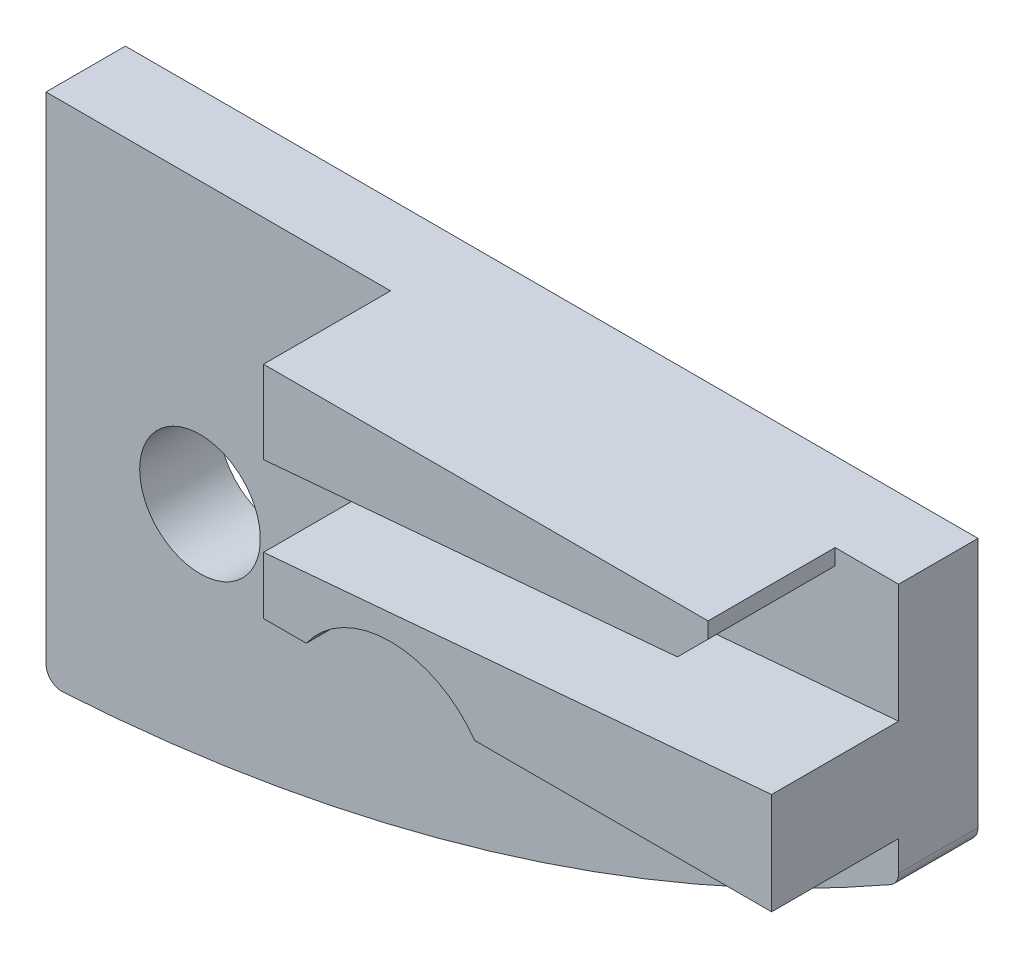
ISO-10303-21;
HEADER;
FILE_DESCRIPTION(('STEP AP214'),'2;1');
FILE_NAME('part.step','',(''),(''),'','','');
FILE_SCHEMA(('AUTOMOTIVE_DESIGN { 1 0 10303 214 1 1 1 1 }'));
ENDSEC;
DATA;
#1=APPLICATION_CONTEXT('core data for automotive mechanical design processes');
#2=APPLICATION_PROTOCOL_DEFINITION('international standard','automotive_design',2000,#1);
#3=PRODUCT_CONTEXT('',#1,'mechanical');
#4=PRODUCT('Part','Part','',(#3));
#5=PRODUCT_RELATED_PRODUCT_CATEGORY('part','',(#4));
#6=PRODUCT_DEFINITION_FORMATION('','',#4);
#7=PRODUCT_DEFINITION_CONTEXT('part definition',#1,'design');
#8=PRODUCT_DEFINITION('design','',#6,#7);
#9=PRODUCT_DEFINITION_SHAPE('','',#8);
#10=(LENGTH_UNIT() NAMED_UNIT(*) SI_UNIT(.MILLI.,.METRE.));
#11=(NAMED_UNIT(*) PLANE_ANGLE_UNIT() SI_UNIT($,.RADIAN.));
#12=(NAMED_UNIT(*) SI_UNIT($,.STERADIAN.) SOLID_ANGLE_UNIT());
#13=UNCERTAINTY_MEASURE_WITH_UNIT(LENGTH_MEASURE(1.E-05),#10,'distance_accuracy_value','');
#14=(GEOMETRIC_REPRESENTATION_CONTEXT(3) GLOBAL_UNCERTAINTY_ASSIGNED_CONTEXT((#13)) GLOBAL_UNIT_ASSIGNED_CONTEXT((#10,
#11,#12)) REPRESENTATION_CONTEXT('',''));
#15=CARTESIAN_POINT('',(0.,0.,0.));
#16=DIRECTION('',(0.,0.,1.));
#17=DIRECTION('',(1.,0.,0.));
#18=AXIS2_PLACEMENT_3D('',#15,#16,#17);
#19=CARTESIAN_POINT('',(50.8,11.7820282764121,8.255));
#20=DIRECTION('',(0.,1.,0.));
#21=DIRECTION('',(0.,0.,1.));
#22=AXIS2_PLACEMENT_3D('',#19,#20,#21);
#23=PLANE('',#22);
#24=DIRECTION('',(-1.,0.,0.));
#25=VECTOR('',#24,1.);
#26=CARTESIAN_POINT('',(50.8,11.7820282764121,3.175));
#27=LINE('',#26,#25);
#28=CARTESIAN_POINT('',(50.8,11.7820282764121,3.175));
#29=VERTEX_POINT('',#28);
#30=CARTESIAN_POINT('',(38.9293716665378,11.7820282764121,3.175));
#31=VERTEX_POINT('',#30);
#32=EDGE_CURVE('E169',#29,#31,#27,.T.);
#33=ORIENTED_EDGE('',*,*,#32,.F.);
#34=DIRECTION('',(0.,0.,-1.));
#35=VECTOR('',#34,1.);
#36=CARTESIAN_POINT('',(50.8,11.7820282764121,8.255));
#37=LINE('',#36,#35);
#38=CARTESIAN_POINT('',(50.8,11.7820282764121,8.255));
#39=VERTEX_POINT('',#38);
#40=EDGE_CURVE('E196',#39,#29,#37,.T.);
#41=ORIENTED_EDGE('',*,*,#40,.F.);
#42=DIRECTION('',(-1.,0.,0.));
#43=VECTOR('',#42,1.);
#44=CARTESIAN_POINT('',(50.8,11.7820282764121,8.255));
#45=LINE('',#44,#43);
#46=CARTESIAN_POINT('',(38.9293716665378,11.7820282764121,8.255));
#47=VERTEX_POINT('',#46);
#48=EDGE_CURVE('E317',#39,#47,#45,.T.);
#49=ORIENTED_EDGE('',*,*,#48,.T.);
#50=DIRECTION('',(0.,0.,1.));
#51=VECTOR('',#50,1.);
#52=CARTESIAN_POINT('',(38.9293716665378,11.7820282764121,3.175));
#53=LINE('',#52,#51);
#54=EDGE_CURVE('E159',#31,#47,#53,.T.);
#55=ORIENTED_EDGE('',*,*,#54,.F.);
#56=EDGE_LOOP('',(#33,#41,#49,#55));
#57=FACE_BOUND('',#56,.T.);
#58=ADVANCED_FACE('F35',(#57),#23,.F.);
#59=CARTESIAN_POINT('',(12.7,76.2,3.175));
#60=DIRECTION('',(0.,0.,-1.));
#61=DIRECTION('',(1.,0.,0.));
#62=AXIS2_PLACEMENT_3D('',#59,#60,#61);
#63=PLANE('',#62);
#64=CARTESIAN_POINT('',(22.86,9.398,3.175));
#65=DIRECTION('',(0.,0.,-1.));
#66=DIRECTION('',(-1.,0.,0.));
#67=AXIS2_PLACEMENT_3D('',#64,#65,#66);
#68=CIRCLE('',#67,2.413);
#69=CARTESIAN_POINT('',(20.447,9.398,3.175));
#70=VERTEX_POINT('',#69);
#71=EDGE_CURVE('E219',#70,#70,#68,.T.);
#72=ORIENTED_EDGE('',*,*,#71,.T.);
#73=EDGE_LOOP('',(#72));
#74=FACE_BOUND('',#73,.T.);
#75=CARTESIAN_POINT('',(32.1906283334622,11.7820282764121,3.175));
#76=VERTEX_POINT('',#75);
#77=CARTESIAN_POINT('',(30.48,11.7820282764121,3.175));
#78=VERTEX_POINT('',#77);
#79=EDGE_CURVE('E167',#76,#78,#27,.T.);
#80=ORIENTED_EDGE('',*,*,#79,.T.);
#81=DIRECTION('',(0.,1.,0.));
#82=VECTOR('',#81,1.);
#83=CARTESIAN_POINT('',(30.48,11.7820282764121,3.175));
#84=LINE('',#83,#82);
#85=CARTESIAN_POINT('',(30.48,14.0758832234899,3.175));
#86=VERTEX_POINT('',#85);
#87=EDGE_CURVE('E187',#78,#86,#84,.T.);
#88=ORIENTED_EDGE('',*,*,#87,.T.);
#89=DIRECTION('',(0.996227084748133,0.0867847660262814,0.));
#90=VECTOR('',#89,1.);
#91=CARTESIAN_POINT('',(50.8,15.8460282764121,3.175));
#92=LINE('',#91,#90);
#93=CARTESIAN_POINT('',(50.8,15.8460282764121,3.175));
#94=VERTEX_POINT('',#93);
#95=EDGE_CURVE('E202',#86,#94,#92,.T.);
#96=ORIENTED_EDGE('',*,*,#95,.T.);
#97=DIRECTION('',(0.,-1.,0.));
#98=VECTOR('',#97,1.);
#99=CARTESIAN_POINT('',(50.8,20.591373254799,3.175));
#100=LINE('',#99,#98);
#101=CARTESIAN_POINT('',(50.8,20.591373254799,3.175));
#102=VERTEX_POINT('',#101);
#103=EDGE_CURVE('E180',#102,#94,#100,.T.);
#104=ORIENTED_EDGE('',*,*,#103,.F.);
#105=DIRECTION('',(1.,0.,0.));
#106=VECTOR('',#105,1.);
#107=CARTESIAN_POINT('',(12.7,20.591373254799,3.175));
#108=LINE('',#107,#106);
#109=CARTESIAN_POINT('',(48.26,20.591373254799,3.175));
#110=VERTEX_POINT('',#109);
#111=EDGE_CURVE('E228',#110,#102,#108,.T.);
#112=ORIENTED_EDGE('',*,*,#111,.F.);
#113=DIRECTION('',(0.,-1.,0.));
#114=VECTOR('',#113,1.);
#115=CARTESIAN_POINT('',(48.26,19.956373254799,3.175));
#116=LINE('',#115,#114);
#117=CARTESIAN_POINT('',(48.26,19.956373254799,3.175));
#118=VERTEX_POINT('',#117);
#119=EDGE_CURVE('E299',#110,#118,#116,.T.);
#120=ORIENTED_EDGE('',*,*,#119,.T.);
#121=DIRECTION('',(-0.70710678118655,-0.707106781186546,0.));
#122=VECTOR('',#121,1.);
#123=CARTESIAN_POINT('',(47.0322104334303,18.7285836882293,3.175));
#124=LINE('',#123,#122);
#125=CARTESIAN_POINT('',(47.0322104334303,18.7285836882293,3.175));
#126=VERTEX_POINT('',#125);
#127=EDGE_CURVE('E302',#118,#126,#124,.T.);
#128=ORIENTED_EDGE('',*,*,#127,.T.);
#129=DIRECTION('',(-0.996227084748133,-0.0867847660262814,0.));
#130=VECTOR('',#129,1.);
#131=CARTESIAN_POINT('',(30.48,17.2866637367694,3.175));
#132=LINE('',#131,#130);
#133=CARTESIAN_POINT('',(30.48,17.2866637367694,3.175));
#134=VERTEX_POINT('',#133);
#135=EDGE_CURVE('E286',#126,#134,#132,.T.);
#136=ORIENTED_EDGE('',*,*,#135,.T.);
#137=DIRECTION('',(0.,1.,0.));
#138=VECTOR('',#137,1.);
#139=CARTESIAN_POINT('',(30.48,20.591373254799,3.175));
#140=LINE('',#139,#138);
#141=CARTESIAN_POINT('',(30.48,20.591373254799,3.175));
#142=VERTEX_POINT('',#141);
#143=EDGE_CURVE('E279',#134,#142,#140,.T.);
#144=ORIENTED_EDGE('',*,*,#143,.T.);
#145=CARTESIAN_POINT('',(16.7,20.591373254799,3.175));
#146=VERTEX_POINT('',#145);
#147=EDGE_CURVE('E230',#146,#142,#108,.T.);
#148=ORIENTED_EDGE('',*,*,#147,.F.);
#149=DIRECTION('',(0.,-1.,0.));
#150=VECTOR('',#149,1.);
#151=CARTESIAN_POINT('',(16.7,24.7848492803447,3.175));
#152=LINE('',#151,#150);
#153=CARTESIAN_POINT('',(16.7,0.77728458879249,3.175));
#154=VERTEX_POINT('',#153);
#155=EDGE_CURVE('E275',#146,#154,#152,.T.);
#156=ORIENTED_EDGE('',*,*,#155,.T.);
#157=CARTESIAN_POINT('',(17.335,0.77728458879249,3.175));
#158=DIRECTION('',(0.,0.,1.));
#159=DIRECTION('',(1.,0.,0.));
#160=AXIS2_PLACEMENT_3D('',#157,#158,#159);
#161=CIRCLE('',#160,0.635);
#162=CARTESIAN_POINT('',(17.3739495798319,0.143480257605869,3.175));
#163=VERTEX_POINT('',#162);
#164=EDGE_CURVE('E268',#163,#154,#161,.F.);
#165=ORIENTED_EDGE('',*,*,#164,.F.);
#166=CARTESIAN_POINT('',(12.7,76.2,3.175));
#167=DIRECTION('',(0.,0.,-1.));
#168=DIRECTION('',(1.,0.,0.));
#169=AXIS2_PLACEMENT_3D('',#166,#167,#168);
#170=CIRCLE('',#169,76.2);
#171=CARTESIAN_POINT('',(50.4798319327731,10.0250477965309,3.175));
#172=VERTEX_POINT('',#171);
#173=EDGE_CURVE('E225',#172,#163,#170,.T.);
#174=ORIENTED_EDGE('',*,*,#173,.F.);
#175=CARTESIAN_POINT('',(50.165,10.5765057315598,3.175));
#176=DIRECTION('',(0.,0.,1.));
#177=DIRECTION('',(1.,0.,0.));
#178=AXIS2_PLACEMENT_3D('',#175,#176,#177);
#179=CIRCLE('',#178,0.635);
#180=CARTESIAN_POINT('',(50.8,10.5765057315598,3.175));
#181=VERTEX_POINT('',#180);
#182=EDGE_CURVE('E43',#181,#172,#179,.F.);
#183=ORIENTED_EDGE('',*,*,#182,.F.);
#184=EDGE_CURVE('E193',#29,#181,#100,.T.);
#185=ORIENTED_EDGE('',*,*,#184,.F.);
#186=ORIENTED_EDGE('',*,*,#32,.T.);
#187=CARTESIAN_POINT('',(35.56,9.398,3.175));
#188=DIRECTION('',(0.,0.,-1.));
#189=DIRECTION('',(-1.,0.,0.));
#190=AXIS2_PLACEMENT_3D('',#187,#188,#189);
#191=CIRCLE('',#190,4.1275);
#192=EDGE_CURVE('E153',#76,#31,#191,.T.);
#193=ORIENTED_EDGE('',*,*,#192,.F.);
#194=EDGE_LOOP('',(#80,#88,#96,#104,#112,#120,#128,#136,#144,#148,#156,#165,#174,#183,#185,#186,#193));
#195=FACE_BOUND('',#194,.T.);
#196=CARTESIAN_POINT('',(35.56,9.398,3.175));
#197=DIRECTION('',(0.,0.,-1.));
#198=DIRECTION('',(-1.,0.,0.));
#199=AXIS2_PLACEMENT_3D('',#196,#197,#198);
#200=CIRCLE('',#199,2.413);
#201=CARTESIAN_POINT('',(33.147,9.398,3.175));
#202=VERTEX_POINT('',#201);
#203=EDGE_CURVE('E213',#202,#202,#200,.T.);
#204=ORIENTED_EDGE('',*,*,#203,.T.);
#205=EDGE_LOOP('',(#204));
#206=FACE_BOUND('',#205,.T.);
#207=ADVANCED_FACE('F164',(#74,#195,#206),#63,.F.);
#208=CARTESIAN_POINT('',(12.7,76.2,0.));
#209=DIRECTION('',(0.,0.,-1.));
#210=DIRECTION('',(1.,0.,0.));
#211=AXIS2_PLACEMENT_3D('',#208,#209,#210);
#212=PLANE('',#211);
#213=CARTESIAN_POINT('',(12.7,76.2,0.));
#214=DIRECTION('',(0.,0.,-1.));
#215=DIRECTION('',(1.,0.,0.));
#216=AXIS2_PLACEMENT_3D('',#213,#214,#215);
#217=CIRCLE('',#216,76.2);
#218=CARTESIAN_POINT('',(50.4798319327731,10.0250477965309,0.));
#219=VERTEX_POINT('',#218);
#220=CARTESIAN_POINT('',(17.3739495798319,0.143480257605869,0.));
#221=VERTEX_POINT('',#220);
#222=EDGE_CURVE('E222',#219,#221,#217,.T.);
#223=ORIENTED_EDGE('',*,*,#222,.T.);
#224=CARTESIAN_POINT('',(17.335,0.77728458879249,0.));
#225=DIRECTION('',(0.,0.,1.));
#226=DIRECTION('',(1.,0.,0.));
#227=AXIS2_PLACEMENT_3D('',#224,#225,#226);
#228=CIRCLE('',#227,0.635);
#229=CARTESIAN_POINT('',(16.7,0.77728458879249,0.));
#230=VERTEX_POINT('',#229);
#231=EDGE_CURVE('E251',#230,#221,#228,.T.);
#232=ORIENTED_EDGE('',*,*,#231,.F.);
#233=DIRECTION('',(0.,1.,0.));
#234=VECTOR('',#233,1.);
#235=CARTESIAN_POINT('',(16.7,76.2,0.));
#236=LINE('',#235,#234);
#237=CARTESIAN_POINT('',(16.7,20.591373254799,0.));
#238=VERTEX_POINT('',#237);
#239=EDGE_CURVE('E277',#230,#238,#236,.T.);
#240=ORIENTED_EDGE('',*,*,#239,.T.);
#241=DIRECTION('',(1.,0.,0.));
#242=VECTOR('',#241,1.);
#243=CARTESIAN_POINT('',(12.7,20.591373254799,0.));
#244=LINE('',#243,#242);
#245=CARTESIAN_POINT('',(50.8,20.591373254799,0.));
#246=VERTEX_POINT('',#245);
#247=EDGE_CURVE('E239',#238,#246,#244,.T.);
#248=ORIENTED_EDGE('',*,*,#247,.T.);
#249=DIRECTION('',(0.,-1.,0.));
#250=VECTOR('',#249,1.);
#251=CARTESIAN_POINT('',(50.8,20.591373254799,0.));
#252=LINE('',#251,#250);
#253=CARTESIAN_POINT('',(50.8,10.5765057315598,0.));
#254=VERTEX_POINT('',#253);
#255=EDGE_CURVE('E229',#246,#254,#252,.T.);
#256=ORIENTED_EDGE('',*,*,#255,.T.);
#257=CARTESIAN_POINT('',(50.165,10.5765057315598,0.));
#258=DIRECTION('',(0.,0.,1.));
#259=DIRECTION('',(1.,0.,0.));
#260=AXIS2_PLACEMENT_3D('',#257,#258,#259);
#261=CIRCLE('',#260,0.635);
#262=EDGE_CURVE('E253',#219,#254,#261,.T.);
#263=ORIENTED_EDGE('',*,*,#262,.F.);
#264=EDGE_LOOP('',(#223,#232,#240,#248,#256,#263));
#265=FACE_BOUND('',#264,.T.);
#266=CARTESIAN_POINT('',(22.86,9.398,0.));
#267=DIRECTION('',(0.,0.,-1.));
#268=DIRECTION('',(-1.,0.,0.));
#269=AXIS2_PLACEMENT_3D('',#266,#267,#268);
#270=CIRCLE('',#269,2.413);
#271=CARTESIAN_POINT('',(20.447,9.398,0.));
#272=VERTEX_POINT('',#271);
#273=EDGE_CURVE('E216',#272,#272,#270,.T.);
#274=ORIENTED_EDGE('',*,*,#273,.F.);
#275=EDGE_LOOP('',(#274));
#276=FACE_BOUND('',#275,.T.);
#277=CARTESIAN_POINT('',(35.56,9.398,0.));
#278=DIRECTION('',(0.,0.,-1.));
#279=DIRECTION('',(-1.,0.,0.));
#280=AXIS2_PLACEMENT_3D('',#277,#278,#279);
#281=CIRCLE('',#280,2.413);
#282=CARTESIAN_POINT('',(33.147,9.398,0.));
#283=VERTEX_POINT('',#282);
#284=EDGE_CURVE('E199',#283,#283,#281,.T.);
#285=ORIENTED_EDGE('',*,*,#284,.F.);
#286=EDGE_LOOP('',(#285));
#287=FACE_BOUND('',#286,.T.);
#288=ADVANCED_FACE('F248',(#265,#276,#287),#212,.T.);
#289=CARTESIAN_POINT('',(12.7,76.2,3.175));
#290=DIRECTION('',(0.,0.,-1.));
#291=DIRECTION('',(1.,0.,0.));
#292=AXIS2_PLACEMENT_3D('',#289,#290,#291);
#293=CYLINDRICAL_SURFACE('',#292,76.2);
#294=ORIENTED_EDGE('',*,*,#173,.T.);
#295=DIRECTION('',(0.,0.,-1.));
#296=VECTOR('',#295,1.);
#297=CARTESIAN_POINT('',(17.3739495798319,0.143480257605882,3.175));
#298=LINE('',#297,#296);
#299=EDGE_CURVE('E178',#221,#163,#298,.F.);
#300=ORIENTED_EDGE('',*,*,#299,.F.);
#301=ORIENTED_EDGE('',*,*,#222,.F.);
#302=DIRECTION('',(0.,0.,-1.));
#303=VECTOR('',#302,1.);
#304=CARTESIAN_POINT('',(50.4798319327731,10.0250477965309,3.175));
#305=LINE('',#304,#303);
#306=EDGE_CURVE('E256',#172,#219,#305,.T.);
#307=ORIENTED_EDGE('',*,*,#306,.F.);
#308=EDGE_LOOP('',(#294,#300,#301,#307));
#309=FACE_BOUND('',#308,.T.);
#310=ADVANCED_FACE('F255',(#309),#293,.T.);
#311=CARTESIAN_POINT('',(12.7,20.591373254799,3.175));
#312=DIRECTION('',(0.,-1.,0.));
#313=DIRECTION('',(-1.,0.,0.));
#314=AXIS2_PLACEMENT_3D('',#311,#312,#313);
#315=PLANE('',#314);
#316=ORIENTED_EDGE('',*,*,#147,.T.);
#317=DIRECTION('',(0.,0.,-1.));
#318=VECTOR('',#317,1.);
#319=CARTESIAN_POINT('',(30.48,20.591373254799,8.255));
#320=LINE('',#319,#318);
#321=CARTESIAN_POINT('',(30.48,20.591373254799,8.255));
#322=VERTEX_POINT('',#321);
#323=EDGE_CURVE('E192',#322,#142,#320,.T.);
#324=ORIENTED_EDGE('',*,*,#323,.F.);
#325=DIRECTION('',(1.,0.,0.));
#326=VECTOR('',#325,1.);
#327=CARTESIAN_POINT('',(48.26,20.591373254799,8.255));
#328=LINE('',#327,#326);
#329=CARTESIAN_POINT('',(48.26,20.591373254799,8.255));
#330=VERTEX_POINT('',#329);
#331=EDGE_CURVE('E285',#322,#330,#328,.T.);
#332=ORIENTED_EDGE('',*,*,#331,.T.);
#333=DIRECTION('',(0.,0.,-1.));
#334=VECTOR('',#333,1.);
#335=CARTESIAN_POINT('',(48.26,20.591373254799,8.255));
#336=LINE('',#335,#334);
#337=EDGE_CURVE('E312',#330,#110,#336,.T.);
#338=ORIENTED_EDGE('',*,*,#337,.T.);
#339=ORIENTED_EDGE('',*,*,#111,.T.);
#340=DIRECTION('',(0.,0.,-1.));
#341=VECTOR('',#340,1.);
#342=CARTESIAN_POINT('',(50.8,20.591373254799,3.175));
#343=LINE('',#342,#341);
#344=EDGE_CURVE('E176',#102,#246,#343,.T.);
#345=ORIENTED_EDGE('',*,*,#344,.T.);
#346=ORIENTED_EDGE('',*,*,#247,.F.);
#347=DIRECTION('',(0.,0.,-1.));
#348=VECTOR('',#347,1.);
#349=CARTESIAN_POINT('',(16.7,20.591373254799,3.175));
#350=LINE('',#349,#348);
#351=EDGE_CURVE('E175',#146,#238,#350,.T.);
#352=ORIENTED_EDGE('',*,*,#351,.F.);
#353=EDGE_LOOP('',(#316,#324,#332,#338,#339,#345,#346,#352));
#354=FACE_BOUND('',#353,.T.);
#355=ADVANCED_FACE('F369',(#354),#315,.F.);
#356=CARTESIAN_POINT('',(50.8,20.591373254799,3.175));
#357=DIRECTION('',(-1.,0.,0.));
#358=DIRECTION('',(0.,0.,-1.));
#359=AXIS2_PLACEMENT_3D('',#356,#357,#358);
#360=PLANE('',#359);
#361=ORIENTED_EDGE('',*,*,#255,.F.);
#362=ORIENTED_EDGE('',*,*,#344,.F.);
#363=ORIENTED_EDGE('',*,*,#103,.T.);
#364=DIRECTION('',(0.,0.,-1.));
#365=VECTOR('',#364,1.);
#366=CARTESIAN_POINT('',(50.8,15.8460282764121,8.255));
#367=LINE('',#366,#365);
#368=CARTESIAN_POINT('',(50.8,15.8460282764121,8.255));
#369=VERTEX_POINT('',#368);
#370=EDGE_CURVE('E206',#369,#94,#367,.T.);
#371=ORIENTED_EDGE('',*,*,#370,.F.);
#372=DIRECTION('',(0.,-1.,0.));
#373=VECTOR('',#372,1.);
#374=CARTESIAN_POINT('',(50.8,15.8460282764121,8.255));
#375=LINE('',#374,#373);
#376=EDGE_CURVE('E205',#369,#39,#375,.T.);
#377=ORIENTED_EDGE('',*,*,#376,.T.);
#378=ORIENTED_EDGE('',*,*,#40,.T.);
#379=ORIENTED_EDGE('',*,*,#184,.T.);
#380=DIRECTION('',(0.,0.,-1.));
#381=VECTOR('',#380,1.);
#382=CARTESIAN_POINT('',(50.8,10.5765057315598,3.175));
#383=LINE('',#382,#381);
#384=EDGE_CURVE('E263',#254,#181,#383,.F.);
#385=ORIENTED_EDGE('',*,*,#384,.F.);
#386=EDGE_LOOP('',(#361,#362,#363,#371,#377,#378,#379,#385));
#387=FACE_BOUND('',#386,.T.);
#388=ADVANCED_FACE('F331',(#387),#360,.F.);
#389=CARTESIAN_POINT('',(22.86,9.398,3.175));
#390=DIRECTION('',(0.,0.,-1.));
#391=DIRECTION('',(1.,0.,0.));
#392=AXIS2_PLACEMENT_3D('',#389,#390,#391);
#393=CYLINDRICAL_SURFACE('',#392,2.413);
#394=ORIENTED_EDGE('',*,*,#71,.F.);
#395=EDGE_LOOP('',(#394));
#396=FACE_BOUND('',#395,.T.);
#397=ORIENTED_EDGE('',*,*,#273,.T.);
#398=EDGE_LOOP('',(#397));
#399=FACE_BOUND('',#398,.T.);
#400=ADVANCED_FACE('F355',(#396,#399),#393,.F.);
#401=CARTESIAN_POINT('',(35.56,9.398,3.175));
#402=DIRECTION('',(0.,0.,-1.));
#403=DIRECTION('',(1.,0.,0.));
#404=AXIS2_PLACEMENT_3D('',#401,#402,#403);
#405=CYLINDRICAL_SURFACE('',#404,2.413);
#406=ORIENTED_EDGE('',*,*,#203,.F.);
#407=EDGE_LOOP('',(#406));
#408=FACE_BOUND('',#407,.T.);
#409=ORIENTED_EDGE('',*,*,#284,.T.);
#410=EDGE_LOOP('',(#409));
#411=FACE_BOUND('',#410,.T.);
#412=ADVANCED_FACE('F350',(#408,#411),#405,.F.);
#413=CARTESIAN_POINT('',(32.1906283334622,11.7820282764121,8.255));
#414=VERTEX_POINT('',#413);
#415=CARTESIAN_POINT('',(30.48,11.7820282764121,8.255));
#416=VERTEX_POINT('',#415);
#417=EDGE_CURVE('E316',#414,#416,#45,.T.);
#418=ORIENTED_EDGE('',*,*,#417,.T.);
#419=DIRECTION('',(0.,0.,-1.));
#420=VECTOR('',#419,1.);
#421=CARTESIAN_POINT('',(30.48,11.7820282764121,8.255));
#422=LINE('',#421,#420);
#423=EDGE_CURVE('E173',#416,#78,#422,.T.);
#424=ORIENTED_EDGE('',*,*,#423,.T.);
#425=ORIENTED_EDGE('',*,*,#79,.F.);
#426=DIRECTION('',(0.,0.,1.));
#427=VECTOR('',#426,1.);
#428=CARTESIAN_POINT('',(32.1906283334622,11.7820282764121,3.175));
#429=LINE('',#428,#427);
#430=EDGE_CURVE('E150',#414,#76,#429,.F.);
#431=ORIENTED_EDGE('',*,*,#430,.F.);
#432=EDGE_LOOP('',(#418,#424,#425,#431));
#433=FACE_BOUND('',#432,.T.);
#434=ADVANCED_FACE('F171',(#433),#23,.F.);
#435=CARTESIAN_POINT('',(30.48,11.7820282764121,8.255));
#436=DIRECTION('',(1.,0.,0.));
#437=DIRECTION('',(0.,0.,1.));
#438=AXIS2_PLACEMENT_3D('',#435,#436,#437);
#439=PLANE('',#438);
#440=ORIENTED_EDGE('',*,*,#87,.F.);
#441=ORIENTED_EDGE('',*,*,#423,.F.);
#442=DIRECTION('',(0.,1.,0.));
#443=VECTOR('',#442,1.);
#444=CARTESIAN_POINT('',(30.48,11.7820282764121,8.255));
#445=LINE('',#444,#443);
#446=CARTESIAN_POINT('',(30.48,14.0758832234899,8.255));
#447=VERTEX_POINT('',#446);
#448=EDGE_CURVE('E319',#416,#447,#445,.T.);
#449=ORIENTED_EDGE('',*,*,#448,.T.);
#450=DIRECTION('',(0.,0.,-1.));
#451=VECTOR('',#450,1.);
#452=CARTESIAN_POINT('',(30.48,14.0758832234899,8.255));
#453=LINE('',#452,#451);
#454=EDGE_CURVE('E210',#447,#86,#453,.T.);
#455=ORIENTED_EDGE('',*,*,#454,.T.);
#456=EDGE_LOOP('',(#440,#441,#449,#455));
#457=FACE_BOUND('',#456,.T.);
#458=ADVANCED_FACE('F334',(#457),#439,.F.);
#459=CARTESIAN_POINT('',(50.8,15.8460282764121,8.255));
#460=DIRECTION('',(0.0867847660262814,-0.996227084748133,0.));
#461=DIRECTION('',(-0.996227084748133,-0.0867847660262814,0.));
#462=AXIS2_PLACEMENT_3D('',#459,#460,#461);
#463=PLANE('',#462);
#464=ORIENTED_EDGE('',*,*,#95,.F.);
#465=ORIENTED_EDGE('',*,*,#454,.F.);
#466=DIRECTION('',(0.996227084748133,0.0867847660262814,0.));
#467=VECTOR('',#466,1.);
#468=CARTESIAN_POINT('',(50.8,15.8460282764121,8.255));
#469=LINE('',#468,#467);
#470=EDGE_CURVE('E185',#447,#369,#469,.T.);
#471=ORIENTED_EDGE('',*,*,#470,.T.);
#472=ORIENTED_EDGE('',*,*,#370,.T.);
#473=EDGE_LOOP('',(#464,#465,#471,#472));
#474=FACE_BOUND('',#473,.T.);
#475=ADVANCED_FACE('F327',(#474),#463,.F.);
#476=CARTESIAN_POINT('',(12.7,0.,8.255));
#477=DIRECTION('',(0.,0.,1.));
#478=DIRECTION('',(-1.,0.,0.));
#479=AXIS2_PLACEMENT_3D('',#476,#477,#478);
#480=PLANE('',#479);
#481=CARTESIAN_POINT('',(35.56,9.398,8.255));
#482=DIRECTION('',(0.,0.,-1.));
#483=DIRECTION('',(-1.,0.,0.));
#484=AXIS2_PLACEMENT_3D('',#481,#482,#483);
#485=CIRCLE('',#484,4.1275);
#486=EDGE_CURVE('E50',#414,#47,#485,.T.);
#487=ORIENTED_EDGE('',*,*,#486,.T.);
#488=ORIENTED_EDGE('',*,*,#48,.F.);
#489=ORIENTED_EDGE('',*,*,#376,.F.);
#490=ORIENTED_EDGE('',*,*,#470,.F.);
#491=ORIENTED_EDGE('',*,*,#448,.F.);
#492=ORIENTED_EDGE('',*,*,#417,.F.);
#493=EDGE_LOOP('',(#487,#488,#489,#490,#491,#492));
#494=FACE_BOUND('',#493,.T.);
#495=ADVANCED_FACE('F336',(#494),#480,.T.);
#496=CARTESIAN_POINT('',(30.48,20.591373254799,8.255));
#497=DIRECTION('',(1.,0.,0.));
#498=DIRECTION('',(0.,0.,1.));
#499=AXIS2_PLACEMENT_3D('',#496,#497,#498);
#500=PLANE('',#499);
#501=ORIENTED_EDGE('',*,*,#143,.F.);
#502=DIRECTION('',(0.,0.,-1.));
#503=VECTOR('',#502,1.);
#504=CARTESIAN_POINT('',(30.48,17.2866637367694,8.255));
#505=LINE('',#504,#503);
#506=CARTESIAN_POINT('',(30.48,17.2866637367694,8.255));
#507=VERTEX_POINT('',#506);
#508=EDGE_CURVE('E297',#507,#134,#505,.T.);
#509=ORIENTED_EDGE('',*,*,#508,.F.);
#510=DIRECTION('',(0.,1.,0.));
#511=VECTOR('',#510,1.);
#512=CARTESIAN_POINT('',(30.48,20.591373254799,8.255));
#513=LINE('',#512,#511);
#514=EDGE_CURVE('E283',#507,#322,#513,.T.);
#515=ORIENTED_EDGE('',*,*,#514,.T.);
#516=ORIENTED_EDGE('',*,*,#323,.T.);
#517=EDGE_LOOP('',(#501,#509,#515,#516));
#518=FACE_BOUND('',#517,.T.);
#519=ADVANCED_FACE('F400',(#518),#500,.F.);
#520=CARTESIAN_POINT('',(48.26,19.956373254799,8.255));
#521=DIRECTION('',(-1.,0.,0.));
#522=DIRECTION('',(0.,0.,-1.));
#523=AXIS2_PLACEMENT_3D('',#520,#521,#522);
#524=PLANE('',#523);
#525=ORIENTED_EDGE('',*,*,#119,.F.);
#526=ORIENTED_EDGE('',*,*,#337,.F.);
#527=DIRECTION('',(0.,-1.,0.));
#528=VECTOR('',#527,1.);
#529=CARTESIAN_POINT('',(48.26,19.956373254799,8.255));
#530=LINE('',#529,#528);
#531=CARTESIAN_POINT('',(48.26,19.956373254799,8.255));
#532=VERTEX_POINT('',#531);
#533=EDGE_CURVE('E289',#330,#532,#530,.T.);
#534=ORIENTED_EDGE('',*,*,#533,.T.);
#535=DIRECTION('',(0.,0.,-1.));
#536=VECTOR('',#535,1.);
#537=CARTESIAN_POINT('',(48.26,19.956373254799,8.255));
#538=LINE('',#537,#536);
#539=EDGE_CURVE('E310',#532,#118,#538,.T.);
#540=ORIENTED_EDGE('',*,*,#539,.T.);
#541=EDGE_LOOP('',(#525,#526,#534,#540));
#542=FACE_BOUND('',#541,.T.);
#543=ADVANCED_FACE('F396',(#542),#524,.F.);
#544=CARTESIAN_POINT('',(47.0322104334303,18.7285836882293,8.255));
#545=DIRECTION('',(-0.707106781186545,0.70710678118655,0.));
#546=DIRECTION('',(0.70710678118655,0.707106781186545,0.));
#547=AXIS2_PLACEMENT_3D('',#544,#545,#546);
#548=PLANE('',#547);
#549=ORIENTED_EDGE('',*,*,#127,.F.);
#550=ORIENTED_EDGE('',*,*,#539,.F.);
#551=DIRECTION('',(-0.70710678118655,-0.707106781186546,0.));
#552=VECTOR('',#551,1.);
#553=CARTESIAN_POINT('',(47.0322104334303,18.7285836882293,8.255));
#554=LINE('',#553,#552);
#555=CARTESIAN_POINT('',(47.0322104334303,18.7285836882293,8.255));
#556=VERTEX_POINT('',#555);
#557=EDGE_CURVE('E292',#532,#556,#554,.T.);
#558=ORIENTED_EDGE('',*,*,#557,.T.);
#559=DIRECTION('',(0.,0.,-1.));
#560=VECTOR('',#559,1.);
#561=CARTESIAN_POINT('',(47.0322104334303,18.7285836882293,8.255));
#562=LINE('',#561,#560);
#563=EDGE_CURVE('E308',#556,#126,#562,.T.);
#564=ORIENTED_EDGE('',*,*,#563,.T.);
#565=EDGE_LOOP('',(#549,#550,#558,#564));
#566=FACE_BOUND('',#565,.T.);
#567=ADVANCED_FACE('F392',(#566),#548,.F.);
#568=CARTESIAN_POINT('',(30.48,17.2866637367694,8.255));
#569=DIRECTION('',(-0.0867847660262814,0.996227084748133,0.));
#570=DIRECTION('',(0.996227084748133,0.0867847660262814,0.));
#571=AXIS2_PLACEMENT_3D('',#568,#569,#570);
#572=PLANE('',#571);
#573=ORIENTED_EDGE('',*,*,#135,.F.);
#574=ORIENTED_EDGE('',*,*,#563,.F.);
#575=DIRECTION('',(-0.996227084748133,-0.0867847660262814,0.));
#576=VECTOR('',#575,1.);
#577=CARTESIAN_POINT('',(30.48,17.2866637367694,8.255));
#578=LINE('',#577,#576);
#579=EDGE_CURVE('E295',#556,#507,#578,.T.);
#580=ORIENTED_EDGE('',*,*,#579,.T.);
#581=ORIENTED_EDGE('',*,*,#508,.T.);
#582=EDGE_LOOP('',(#573,#574,#580,#581));
#583=FACE_BOUND('',#582,.T.);
#584=ADVANCED_FACE('F385',(#583),#572,.F.);
#585=CARTESIAN_POINT('',(12.7,0.,8.255));
#586=DIRECTION('',(0.,0.,1.));
#587=DIRECTION('',(-1.,0.,0.));
#588=AXIS2_PLACEMENT_3D('',#585,#586,#587);
#589=PLANE('',#588);
#590=ORIENTED_EDGE('',*,*,#514,.F.);
#591=ORIENTED_EDGE('',*,*,#579,.F.);
#592=ORIENTED_EDGE('',*,*,#557,.F.);
#593=ORIENTED_EDGE('',*,*,#533,.F.);
#594=ORIENTED_EDGE('',*,*,#331,.F.);
#595=EDGE_LOOP('',(#590,#591,#592,#593,#594));
#596=FACE_BOUND('',#595,.T.);
#597=ADVANCED_FACE('F380',(#596),#589,.T.);
#598=CARTESIAN_POINT('',(16.7,24.7848492803447,-1.905));
#599=DIRECTION('',(1.,0.,0.));
#600=DIRECTION('',(0.,-1.,0.));
#601=AXIS2_PLACEMENT_3D('',#598,#599,#600);
#602=PLANE('',#601);
#603=ORIENTED_EDGE('',*,*,#155,.F.);
#604=ORIENTED_EDGE('',*,*,#351,.T.);
#605=ORIENTED_EDGE('',*,*,#239,.F.);
#606=DIRECTION('',(0.,0.,-1.));
#607=VECTOR('',#606,1.);
#608=CARTESIAN_POINT('',(16.7,0.77728458879249,-1.905));
#609=LINE('',#608,#607);
#610=EDGE_CURVE('E11',#154,#230,#609,.T.);
#611=ORIENTED_EDGE('',*,*,#610,.F.);
#612=EDGE_LOOP('',(#603,#604,#605,#611));
#613=FACE_BOUND('',#612,.T.);
#614=ADVANCED_FACE('F375',(#613),#602,.F.);
#615=CARTESIAN_POINT('',(50.165,10.5765057315598,3.175));
#616=DIRECTION('',(0.,0.,-1.));
#617=DIRECTION('',(1.,0.,0.));
#618=AXIS2_PLACEMENT_3D('',#615,#616,#617);
#619=CYLINDRICAL_SURFACE('',#618,0.635);
#620=ORIENTED_EDGE('',*,*,#182,.T.);
#621=ORIENTED_EDGE('',*,*,#306,.T.);
#622=ORIENTED_EDGE('',*,*,#262,.T.);
#623=ORIENTED_EDGE('',*,*,#384,.T.);
#624=EDGE_LOOP('',(#620,#621,#622,#623));
#625=FACE_BOUND('',#624,.T.);
#626=ADVANCED_FACE('F271',(#625),#619,.T.);
#627=CARTESIAN_POINT('',(17.335,0.77728458879249,3.175));
#628=DIRECTION('',(0.,0.,-1.));
#629=DIRECTION('',(1.,0.,0.));
#630=AXIS2_PLACEMENT_3D('',#627,#628,#629);
#631=CYLINDRICAL_SURFACE('',#630,0.635);
#632=ORIENTED_EDGE('',*,*,#231,.T.);
#633=ORIENTED_EDGE('',*,*,#299,.T.);
#634=ORIENTED_EDGE('',*,*,#164,.T.);
#635=ORIENTED_EDGE('',*,*,#610,.T.);
#636=EDGE_LOOP('',(#632,#633,#634,#635));
#637=FACE_BOUND('',#636,.T.);
#638=ADVANCED_FACE('F37',(#637),#631,.T.);
#639=CARTESIAN_POINT('',(35.56,9.398,3.175));
#640=DIRECTION('',(0.,0.,1.));
#641=DIRECTION('',(-1.,0.,0.));
#642=AXIS2_PLACEMENT_3D('',#639,#640,#641);
#643=CYLINDRICAL_SURFACE('',#642,4.1275);
#644=ORIENTED_EDGE('',*,*,#192,.T.);
#645=ORIENTED_EDGE('',*,*,#54,.T.);
#646=ORIENTED_EDGE('',*,*,#486,.F.);
#647=ORIENTED_EDGE('',*,*,#430,.T.);
#648=EDGE_LOOP('',(#644,#645,#646,#647));
#649=FACE_BOUND('',#648,.T.);
#650=ADVANCED_FACE('F152',(#649),#643,.F.);
#651=CLOSED_SHELL('',(#58,#207,#288,#310,#355,#388,#400,#412,#434,#458,#475,#495,#519,#543,#567,
#584,#597,#614,#626,#638,#650));
#652=MANIFOLD_SOLID_BREP('B2',#651);
#653=ADVANCED_BREP_SHAPE_REPRESENTATION('',(#18,#652),#14);
#654=SHAPE_DEFINITION_REPRESENTATION(#9,#653);
ENDSEC;
END-ISO-10303-21;
